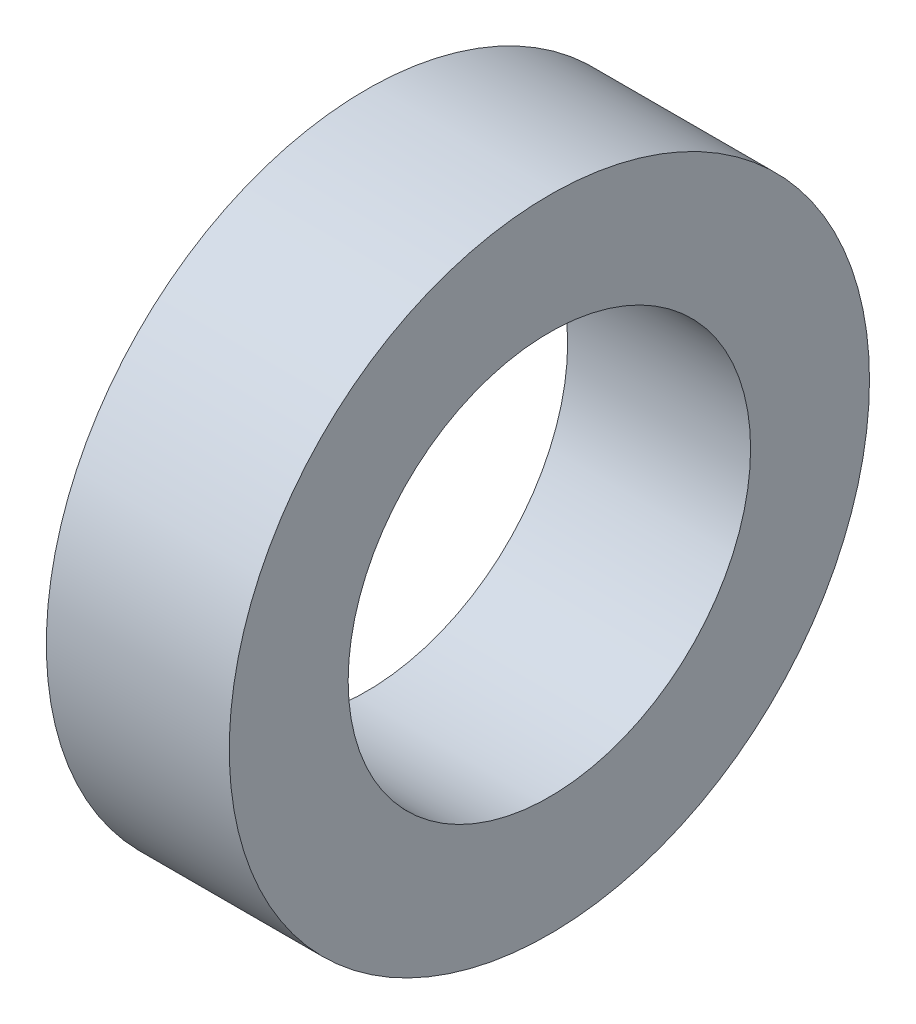
ISO-10303-21;
HEADER;
FILE_DESCRIPTION(('STEP AP214'),'2;1');
FILE_NAME('part.step','',(''),(''),'','','');
FILE_SCHEMA(('AUTOMOTIVE_DESIGN { 1 0 10303 214 1 1 1 1 }'));
ENDSEC;
DATA;
#1=APPLICATION_CONTEXT('core data for automotive mechanical design processes');
#2=APPLICATION_PROTOCOL_DEFINITION('international standard','automotive_design',2000,#1);
#3=PRODUCT_CONTEXT('',#1,'mechanical');
#4=PRODUCT('Part','Part','',(#3));
#5=PRODUCT_RELATED_PRODUCT_CATEGORY('part','',(#4));
#6=PRODUCT_DEFINITION_FORMATION('','',#4);
#7=PRODUCT_DEFINITION_CONTEXT('part definition',#1,'design');
#8=PRODUCT_DEFINITION('design','',#6,#7);
#9=PRODUCT_DEFINITION_SHAPE('','',#8);
#10=(LENGTH_UNIT() NAMED_UNIT(*) SI_UNIT(.MILLI.,.METRE.));
#11=(NAMED_UNIT(*) PLANE_ANGLE_UNIT() SI_UNIT($,.RADIAN.));
#12=(NAMED_UNIT(*) SI_UNIT($,.STERADIAN.) SOLID_ANGLE_UNIT());
#13=UNCERTAINTY_MEASURE_WITH_UNIT(LENGTH_MEASURE(1.E-05),#10,'distance_accuracy_value','');
#14=(GEOMETRIC_REPRESENTATION_CONTEXT(3) GLOBAL_UNCERTAINTY_ASSIGNED_CONTEXT((#13)) GLOBAL_UNIT_ASSIGNED_CONTEXT((#10,
#11,#12)) REPRESENTATION_CONTEXT('',''));
#15=CARTESIAN_POINT('',(0.,0.,0.));
#16=DIRECTION('',(0.,0.,1.));
#17=DIRECTION('',(1.,0.,0.));
#18=AXIS2_PLACEMENT_3D('',#15,#16,#17);
#19=CARTESIAN_POINT('',(2.54,0.,0.));
#20=DIRECTION('',(-1.,0.,0.));
#21=DIRECTION('',(0.,0.,1.));
#22=AXIS2_PLACEMENT_3D('',#19,#20,#21);
#23=CYLINDRICAL_SURFACE('',#22,2.794);
#24=CARTESIAN_POINT('',(2.54,0.,0.));
#25=DIRECTION('',(1.,0.,0.));
#26=DIRECTION('',(0.,0.,-1.));
#27=AXIS2_PLACEMENT_3D('',#24,#25,#26);
#28=CIRCLE('',#27,2.794);
#29=CARTESIAN_POINT('',(2.54,0.,-2.794));
#30=VERTEX_POINT('',#29);
#31=EDGE_CURVE('E44',#30,#30,#28,.T.);
#32=ORIENTED_EDGE('',*,*,#31,.T.);
#33=EDGE_LOOP('',(#32));
#34=FACE_BOUND('',#33,.T.);
#35=CARTESIAN_POINT('',(0.,0.,0.));
#36=DIRECTION('',(1.,0.,0.));
#37=DIRECTION('',(0.,0.,-1.));
#38=AXIS2_PLACEMENT_3D('',#35,#36,#37);
#39=CIRCLE('',#38,2.794);
#40=CARTESIAN_POINT('',(0.,0.,-2.794));
#41=VERTEX_POINT('',#40);
#42=EDGE_CURVE('E50',#41,#41,#39,.T.);
#43=ORIENTED_EDGE('',*,*,#42,.F.);
#44=EDGE_LOOP('',(#43));
#45=FACE_BOUND('',#44,.T.);
#46=ADVANCED_FACE('F37',(#34,#45),#23,.F.);
#47=CARTESIAN_POINT('',(2.54,0.,0.));
#48=DIRECTION('',(-1.,0.,0.));
#49=DIRECTION('',(0.,0.,1.));
#50=AXIS2_PLACEMENT_3D('',#47,#48,#49);
#51=CYLINDRICAL_SURFACE('',#50,4.445);
#52=CARTESIAN_POINT('',(2.54,0.,0.));
#53=DIRECTION('',(1.,0.,0.));
#54=DIRECTION('',(0.,0.,-1.));
#55=AXIS2_PLACEMENT_3D('',#52,#53,#54);
#56=CIRCLE('',#55,4.445);
#57=CARTESIAN_POINT('',(2.54,0.,-4.445));
#58=VERTEX_POINT('',#57);
#59=EDGE_CURVE('E10',#58,#58,#56,.T.);
#60=ORIENTED_EDGE('',*,*,#59,.F.);
#61=EDGE_LOOP('',(#60));
#62=FACE_BOUND('',#61,.T.);
#63=CARTESIAN_POINT('',(0.,0.,0.));
#64=DIRECTION('',(1.,0.,0.));
#65=DIRECTION('',(0.,0.,-1.));
#66=AXIS2_PLACEMENT_3D('',#63,#64,#65);
#67=CIRCLE('',#66,4.445);
#68=CARTESIAN_POINT('',(0.,0.,-4.445));
#69=VERTEX_POINT('',#68);
#70=EDGE_CURVE('E40',#69,#69,#67,.T.);
#71=ORIENTED_EDGE('',*,*,#70,.T.);
#72=EDGE_LOOP('',(#71));
#73=FACE_BOUND('',#72,.T.);
#74=ADVANCED_FACE('F57',(#62,#73),#51,.T.);
#75=CARTESIAN_POINT('',(2.54,0.,0.));
#76=DIRECTION('',(1.,0.,0.));
#77=DIRECTION('',(0.,0.,-1.));
#78=AXIS2_PLACEMENT_3D('',#75,#76,#77);
#79=PLANE('',#78);
#80=ORIENTED_EDGE('',*,*,#31,.F.);
#81=EDGE_LOOP('',(#80));
#82=FACE_BOUND('',#81,.T.);
#83=ORIENTED_EDGE('',*,*,#59,.T.);
#84=EDGE_LOOP('',(#83));
#85=FACE_BOUND('',#84,.T.);
#86=ADVANCED_FACE('F61',(#82,#85),#79,.T.);
#87=CARTESIAN_POINT('',(0.,0.,0.));
#88=DIRECTION('',(1.,0.,0.));
#89=DIRECTION('',(0.,0.,-1.));
#90=AXIS2_PLACEMENT_3D('',#87,#88,#89);
#91=PLANE('',#90);
#92=ORIENTED_EDGE('',*,*,#42,.T.);
#93=EDGE_LOOP('',(#92));
#94=FACE_BOUND('',#93,.T.);
#95=ORIENTED_EDGE('',*,*,#70,.F.);
#96=EDGE_LOOP('',(#95));
#97=FACE_BOUND('',#96,.T.);
#98=ADVANCED_FACE('F59',(#94,#97),#91,.F.);
#99=CLOSED_SHELL('',(#46,#74,#86,#98));
#100=MANIFOLD_SOLID_BREP('B2',#99);
#101=ADVANCED_BREP_SHAPE_REPRESENTATION('',(#18,#100),#14);
#102=SHAPE_DEFINITION_REPRESENTATION(#9,#101);
ENDSEC;
END-ISO-10303-21;
